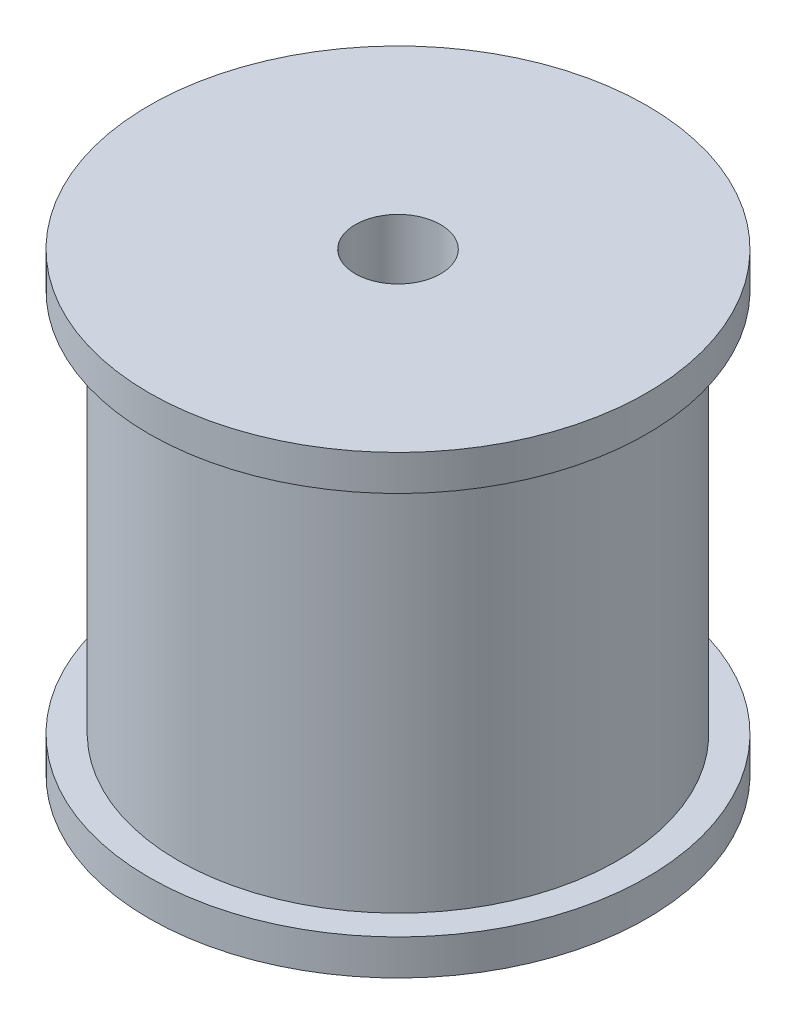
ISO-10303-21;
HEADER;
FILE_DESCRIPTION(('STEP AP214'),'2;1');
FILE_NAME('part.step','',(''),(''),'','','');
FILE_SCHEMA(('AUTOMOTIVE_DESIGN { 1 0 10303 214 1 1 1 1 }'));
ENDSEC;
DATA;
#1=APPLICATION_CONTEXT('core data for automotive mechanical design processes');
#2=APPLICATION_PROTOCOL_DEFINITION('international standard','automotive_design',2000,#1);
#3=PRODUCT_CONTEXT('',#1,'mechanical');
#4=PRODUCT('Part','Part','',(#3));
#5=PRODUCT_RELATED_PRODUCT_CATEGORY('part','',(#4));
#6=PRODUCT_DEFINITION_FORMATION('','',#4);
#7=PRODUCT_DEFINITION_CONTEXT('part definition',#1,'design');
#8=PRODUCT_DEFINITION('design','',#6,#7);
#9=PRODUCT_DEFINITION_SHAPE('','',#8);
#10=(LENGTH_UNIT() NAMED_UNIT(*) SI_UNIT(.MILLI.,.METRE.));
#11=(NAMED_UNIT(*) PLANE_ANGLE_UNIT() SI_UNIT($,.RADIAN.));
#12=(NAMED_UNIT(*) SI_UNIT($,.STERADIAN.) SOLID_ANGLE_UNIT());
#13=UNCERTAINTY_MEASURE_WITH_UNIT(LENGTH_MEASURE(1.E-05),#10,'distance_accuracy_value','');
#14=(GEOMETRIC_REPRESENTATION_CONTEXT(3) GLOBAL_UNCERTAINTY_ASSIGNED_CONTEXT((#13)) GLOBAL_UNIT_ASSIGNED_CONTEXT((#10,
#11,#12)) REPRESENTATION_CONTEXT('',''));
#15=CARTESIAN_POINT('',(0.,0.,0.));
#16=DIRECTION('',(0.,0.,1.));
#17=DIRECTION('',(1.,0.,0.));
#18=AXIS2_PLACEMENT_3D('',#15,#16,#17);
#19=CARTESIAN_POINT('',(0.,13.5,0.));
#20=DIRECTION('',(0.,-1.,0.));
#21=DIRECTION('',(0.,0.,-1.));
#22=AXIS2_PLACEMENT_3D('',#19,#20,#21);
#23=CYLINDRICAL_SURFACE('',#22,15.45);
#24=CARTESIAN_POINT('',(0.,13.5,0.));
#25=DIRECTION('',(0.,1.,0.));
#26=DIRECTION('',(0.,0.,1.));
#27=AXIS2_PLACEMENT_3D('',#24,#25,#26);
#28=CIRCLE('',#27,15.45);
#29=CARTESIAN_POINT('',(0.,13.5,15.45));
#30=VERTEX_POINT('',#29);
#31=EDGE_CURVE('E10',#30,#30,#28,.T.);
#32=ORIENTED_EDGE('',*,*,#31,.F.);
#33=EDGE_LOOP('',(#32));
#34=FACE_BOUND('',#33,.T.);
#35=CARTESIAN_POINT('',(0.,-13.5,0.));
#36=DIRECTION('',(0.,1.,0.));
#37=DIRECTION('',(0.,0.,1.));
#38=AXIS2_PLACEMENT_3D('',#35,#36,#37);
#39=CIRCLE('',#38,15.45);
#40=CARTESIAN_POINT('',(0.,-13.5,15.45));
#41=VERTEX_POINT('',#40);
#42=EDGE_CURVE('E44',#41,#41,#39,.T.);
#43=ORIENTED_EDGE('',*,*,#42,.T.);
#44=EDGE_LOOP('',(#43));
#45=FACE_BOUND('',#44,.T.);
#46=ADVANCED_FACE('F41',(#34,#45),#23,.T.);
#47=CARTESIAN_POINT('',(0.,16.,0.));
#48=DIRECTION('',(0.,-1.,0.));
#49=DIRECTION('',(0.,0.,-1.));
#50=AXIS2_PLACEMENT_3D('',#47,#48,#49);
#51=CYLINDRICAL_SURFACE('',#50,17.5);
#52=CARTESIAN_POINT('',(0.,16.,0.));
#53=DIRECTION('',(0.,1.,0.));
#54=DIRECTION('',(0.,0.,1.));
#55=AXIS2_PLACEMENT_3D('',#52,#53,#54);
#56=CIRCLE('',#55,17.5);
#57=CARTESIAN_POINT('',(0.,16.,17.5));
#58=VERTEX_POINT('',#57);
#59=EDGE_CURVE('E48',#58,#58,#56,.T.);
#60=ORIENTED_EDGE('',*,*,#59,.F.);
#61=EDGE_LOOP('',(#60));
#62=FACE_BOUND('',#61,.T.);
#63=CARTESIAN_POINT('',(0.,13.5,0.));
#64=DIRECTION('',(0.,1.,0.));
#65=DIRECTION('',(0.,0.,1.));
#66=AXIS2_PLACEMENT_3D('',#63,#64,#65);
#67=CIRCLE('',#66,17.5);
#68=CARTESIAN_POINT('',(0.,13.5,17.5));
#69=VERTEX_POINT('',#68);
#70=EDGE_CURVE('E52',#69,#69,#67,.T.);
#71=ORIENTED_EDGE('',*,*,#70,.T.);
#72=EDGE_LOOP('',(#71));
#73=FACE_BOUND('',#72,.T.);
#74=ADVANCED_FACE('F84',(#62,#73),#51,.T.);
#75=CARTESIAN_POINT('',(0.,16.,0.));
#76=DIRECTION('',(0.,1.,0.));
#77=DIRECTION('',(0.,0.,1.));
#78=AXIS2_PLACEMENT_3D('',#75,#76,#77);
#79=PLANE('',#78);
#80=CARTESIAN_POINT('',(0.,16.,0.));
#81=DIRECTION('',(0.,1.,0.));
#82=DIRECTION('',(0.,0.,1.));
#83=AXIS2_PLACEMENT_3D('',#80,#81,#82);
#84=CIRCLE('',#83,3.);
#85=CARTESIAN_POINT('',(0.,16.,3.));
#86=VERTEX_POINT('',#85);
#87=EDGE_CURVE('E64',#86,#86,#84,.T.);
#88=ORIENTED_EDGE('',*,*,#87,.F.);
#89=EDGE_LOOP('',(#88));
#90=FACE_BOUND('',#89,.T.);
#91=ORIENTED_EDGE('',*,*,#59,.T.);
#92=EDGE_LOOP('',(#91));
#93=FACE_BOUND('',#92,.T.);
#94=ADVANCED_FACE('F80',(#90,#93),#79,.T.);
#95=CARTESIAN_POINT('',(0.,13.5,0.));
#96=DIRECTION('',(0.,1.,0.));
#97=DIRECTION('',(0.,0.,1.));
#98=AXIS2_PLACEMENT_3D('',#95,#96,#97);
#99=PLANE('',#98);
#100=ORIENTED_EDGE('',*,*,#31,.T.);
#101=EDGE_LOOP('',(#100));
#102=FACE_BOUND('',#101,.T.);
#103=ORIENTED_EDGE('',*,*,#70,.F.);
#104=EDGE_LOOP('',(#103));
#105=FACE_BOUND('',#104,.T.);
#106=ADVANCED_FACE('F83',(#102,#105),#99,.F.);
#107=CARTESIAN_POINT('',(0.,-16.,0.));
#108=DIRECTION('',(0.,1.,0.));
#109=DIRECTION('',(0.,0.,1.));
#110=AXIS2_PLACEMENT_3D('',#107,#108,#109);
#111=CYLINDRICAL_SURFACE('',#110,17.5);
#112=CARTESIAN_POINT('',(0.,-16.,0.));
#113=DIRECTION('',(0.,-1.,0.));
#114=DIRECTION('',(0.,0.,-1.));
#115=AXIS2_PLACEMENT_3D('',#112,#113,#114);
#116=CIRCLE('',#115,17.5);
#117=CARTESIAN_POINT('',(0.,-16.,-17.5));
#118=VERTEX_POINT('',#117);
#119=EDGE_CURVE('E60',#118,#118,#116,.T.);
#120=ORIENTED_EDGE('',*,*,#119,.F.);
#121=EDGE_LOOP('',(#120));
#122=FACE_BOUND('',#121,.T.);
#123=CARTESIAN_POINT('',(0.,-13.5,0.));
#124=DIRECTION('',(0.,-1.,0.));
#125=DIRECTION('',(0.,0.,-1.));
#126=AXIS2_PLACEMENT_3D('',#123,#124,#125);
#127=CIRCLE('',#126,17.5);
#128=CARTESIAN_POINT('',(0.,-13.5,-17.5));
#129=VERTEX_POINT('',#128);
#130=EDGE_CURVE('E57',#129,#129,#127,.T.);
#131=ORIENTED_EDGE('',*,*,#130,.T.);
#132=EDGE_LOOP('',(#131));
#133=FACE_BOUND('',#132,.T.);
#134=ADVANCED_FACE('F93',(#122,#133),#111,.T.);
#135=CARTESIAN_POINT('',(0.,-16.,0.));
#136=DIRECTION('',(0.,-1.,0.));
#137=DIRECTION('',(0.,0.,-1.));
#138=AXIS2_PLACEMENT_3D('',#135,#136,#137);
#139=PLANE('',#138);
#140=CARTESIAN_POINT('',(0.,-16.,0.));
#141=DIRECTION('',(0.,1.,0.));
#142=DIRECTION('',(0.,0.,1.));
#143=AXIS2_PLACEMENT_3D('',#140,#141,#142);
#144=CIRCLE('',#143,3.);
#145=CARTESIAN_POINT('',(0.,-16.,3.));
#146=VERTEX_POINT('',#145);
#147=EDGE_CURVE('E61',#146,#146,#144,.T.);
#148=ORIENTED_EDGE('',*,*,#147,.T.);
#149=EDGE_LOOP('',(#148));
#150=FACE_BOUND('',#149,.T.);
#151=ORIENTED_EDGE('',*,*,#119,.T.);
#152=EDGE_LOOP('',(#151));
#153=FACE_BOUND('',#152,.T.);
#154=ADVANCED_FACE('F70',(#150,#153),#139,.T.);
#155=CARTESIAN_POINT('',(0.,-13.5,0.));
#156=DIRECTION('',(0.,-1.,0.));
#157=DIRECTION('',(0.,0.,-1.));
#158=AXIS2_PLACEMENT_3D('',#155,#156,#157);
#159=PLANE('',#158);
#160=ORIENTED_EDGE('',*,*,#42,.F.);
#161=EDGE_LOOP('',(#160));
#162=FACE_BOUND('',#161,.T.);
#163=ORIENTED_EDGE('',*,*,#130,.F.);
#164=EDGE_LOOP('',(#163));
#165=FACE_BOUND('',#164,.T.);
#166=ADVANCED_FACE('F76',(#162,#165),#159,.F.);
#167=CARTESIAN_POINT('',(0.,-16.,0.));
#168=DIRECTION('',(0.,1.,0.));
#169=DIRECTION('',(0.,0.,1.));
#170=AXIS2_PLACEMENT_3D('',#167,#168,#169);
#171=CYLINDRICAL_SURFACE('',#170,3.);
#172=ORIENTED_EDGE('',*,*,#147,.F.);
#173=EDGE_LOOP('',(#172));
#174=FACE_BOUND('',#173,.T.);
#175=ORIENTED_EDGE('',*,*,#87,.T.);
#176=EDGE_LOOP('',(#175));
#177=FACE_BOUND('',#176,.T.);
#178=ADVANCED_FACE('F73',(#174,#177),#171,.F.);
#179=CLOSED_SHELL('',(#46,#74,#94,#106,#134,#154,#166,#178));
#180=MANIFOLD_SOLID_BREP('B2',#179);
#181=ADVANCED_BREP_SHAPE_REPRESENTATION('',(#18,#180),#14);
#182=SHAPE_DEFINITION_REPRESENTATION(#9,#181);
ENDSEC;
END-ISO-10303-21;
